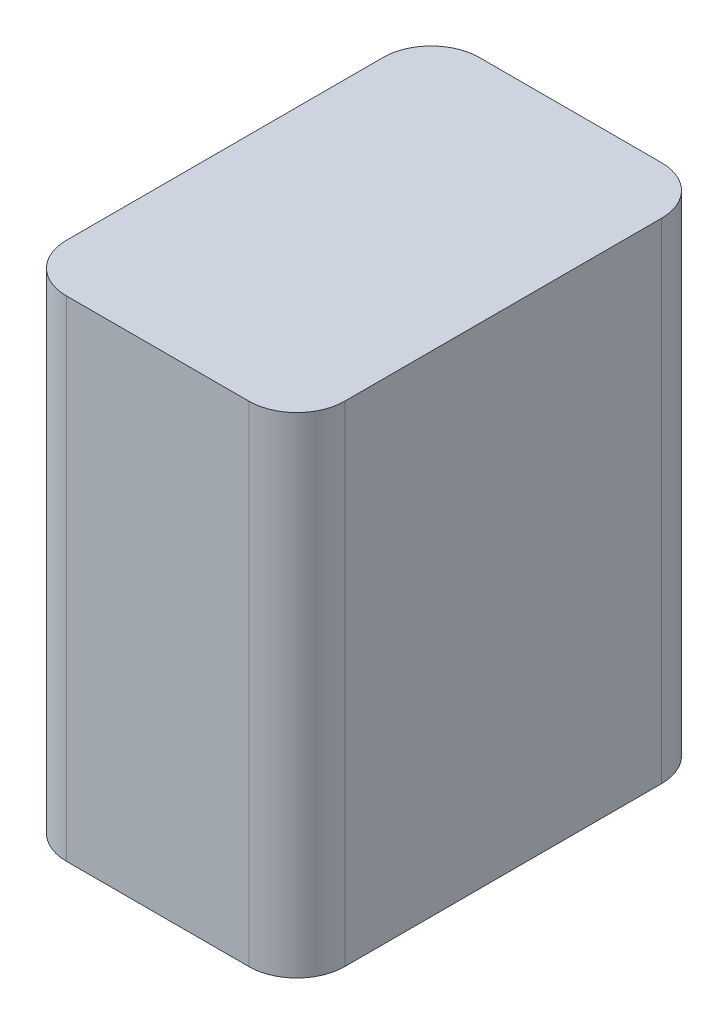
ISO-10303-21;
HEADER;
FILE_DESCRIPTION(('STEP AP214'),'2;1');
FILE_NAME('part.step','',(''),(''),'','','');
FILE_SCHEMA(('AUTOMOTIVE_DESIGN { 1 0 10303 214 1 1 1 1 }'));
ENDSEC;
DATA;
#1=APPLICATION_CONTEXT('core data for automotive mechanical design processes');
#2=APPLICATION_PROTOCOL_DEFINITION('international standard','automotive_design',2000,#1);
#3=PRODUCT_CONTEXT('',#1,'mechanical');
#4=PRODUCT('Part','Part','',(#3));
#5=PRODUCT_RELATED_PRODUCT_CATEGORY('part','',(#4));
#6=PRODUCT_DEFINITION_FORMATION('','',#4);
#7=PRODUCT_DEFINITION_CONTEXT('part definition',#1,'design');
#8=PRODUCT_DEFINITION('design','',#6,#7);
#9=PRODUCT_DEFINITION_SHAPE('','',#8);
#10=(LENGTH_UNIT() NAMED_UNIT(*) SI_UNIT(.MILLI.,.METRE.));
#11=(NAMED_UNIT(*) PLANE_ANGLE_UNIT() SI_UNIT($,.RADIAN.));
#12=(NAMED_UNIT(*) SI_UNIT($,.STERADIAN.) SOLID_ANGLE_UNIT());
#13=UNCERTAINTY_MEASURE_WITH_UNIT(LENGTH_MEASURE(1.E-05),#10,'distance_accuracy_value','');
#14=(GEOMETRIC_REPRESENTATION_CONTEXT(3) GLOBAL_UNCERTAINTY_ASSIGNED_CONTEXT((#13)) GLOBAL_UNIT_ASSIGNED_CONTEXT((#10,
#11,#12)) REPRESENTATION_CONTEXT('',''));
#15=CARTESIAN_POINT('',(0.,0.,0.));
#16=DIRECTION('',(0.,0.,1.));
#17=DIRECTION('',(1.,0.,0.));
#18=AXIS2_PLACEMENT_3D('',#15,#16,#17);
#19=CARTESIAN_POINT('',(0.,51.,0.));
#20=DIRECTION('',(1.,0.,0.));
#21=DIRECTION('',(0.,0.,-1.));
#22=AXIS2_PLACEMENT_3D('',#19,#20,#21);
#23=PLANE('',#22);
#24=DIRECTION('',(0.,0.,1.));
#25=VECTOR('',#24,1.);
#26=CARTESIAN_POINT('',(0.,51.,0.));
#27=LINE('',#26,#25);
#28=CARTESIAN_POINT('',(0.,51.,-38.));
#29=VERTEX_POINT('',#28);
#30=CARTESIAN_POINT('',(0.,51.,-5.));
#31=VERTEX_POINT('',#30);
#32=EDGE_CURVE('E127',#29,#31,#27,.T.);
#33=ORIENTED_EDGE('',*,*,#32,.F.);
#34=DIRECTION('',(0.,-1.,0.));
#35=VECTOR('',#34,1.);
#36=CARTESIAN_POINT('',(0.,51.,-38.));
#37=LINE('',#36,#35);
#38=CARTESIAN_POINT('',(0.,0.,-38.));
#39=VERTEX_POINT('',#38);
#40=EDGE_CURVE('E111',#29,#39,#37,.T.);
#41=ORIENTED_EDGE('',*,*,#40,.T.);
#42=DIRECTION('',(0.,0.,1.));
#43=VECTOR('',#42,1.);
#44=CARTESIAN_POINT('',(0.,0.,0.));
#45=LINE('',#44,#43);
#46=CARTESIAN_POINT('',(0.,0.,-5.));
#47=VERTEX_POINT('',#46);
#48=EDGE_CURVE('E124',#39,#47,#45,.T.);
#49=ORIENTED_EDGE('',*,*,#48,.T.);
#50=DIRECTION('',(0.,-1.,0.));
#51=VECTOR('',#50,1.);
#52=CARTESIAN_POINT('',(0.,51.,-5.));
#53=LINE('',#52,#51);
#54=EDGE_CURVE('E130',#47,#31,#53,.F.);
#55=ORIENTED_EDGE('',*,*,#54,.T.);
#56=EDGE_LOOP('',(#33,#41,#49,#55));
#57=FACE_BOUND('',#56,.T.);
#58=ADVANCED_FACE('F39',(#57),#23,.F.);
#59=CARTESIAN_POINT('',(0.,51.,0.));
#60=DIRECTION('',(0.,0.,-1.));
#61=DIRECTION('',(-1.,0.,0.));
#62=AXIS2_PLACEMENT_3D('',#59,#60,#61);
#63=PLANE('',#62);
#64=DIRECTION('',(1.,0.,0.));
#65=VECTOR('',#64,1.);
#66=CARTESIAN_POINT('',(0.,51.,0.));
#67=LINE('',#66,#65);
#68=CARTESIAN_POINT('',(5.,51.,0.));
#69=VERTEX_POINT('',#68);
#70=CARTESIAN_POINT('',(24.,51.,0.));
#71=VERTEX_POINT('',#70);
#72=EDGE_CURVE('E185',#69,#71,#67,.T.);
#73=ORIENTED_EDGE('',*,*,#72,.F.);
#74=DIRECTION('',(0.,-1.,0.));
#75=VECTOR('',#74,1.);
#76=CARTESIAN_POINT('',(5.,51.,0.));
#77=LINE('',#76,#75);
#78=CARTESIAN_POINT('',(5.,0.,0.));
#79=VERTEX_POINT('',#78);
#80=EDGE_CURVE('E11',#69,#79,#77,.T.);
#81=ORIENTED_EDGE('',*,*,#80,.T.);
#82=DIRECTION('',(1.,0.,0.));
#83=VECTOR('',#82,1.);
#84=CARTESIAN_POINT('',(0.,0.,0.));
#85=LINE('',#84,#83);
#86=CARTESIAN_POINT('',(24.,0.,0.));
#87=VERTEX_POINT('',#86);
#88=EDGE_CURVE('E136',#79,#87,#85,.T.);
#89=ORIENTED_EDGE('',*,*,#88,.T.);
#90=DIRECTION('',(0.,-1.,0.));
#91=VECTOR('',#90,1.);
#92=CARTESIAN_POINT('',(24.,51.,0.));
#93=LINE('',#92,#91);
#94=EDGE_CURVE('E48',#87,#71,#93,.F.);
#95=ORIENTED_EDGE('',*,*,#94,.T.);
#96=EDGE_LOOP('',(#73,#81,#89,#95));
#97=FACE_BOUND('',#96,.T.);
#98=ADVANCED_FACE('F184',(#97),#63,.F.);
#99=CARTESIAN_POINT('',(29.,51.,0.));
#100=DIRECTION('',(-1.,0.,0.));
#101=DIRECTION('',(0.,0.,1.));
#102=AXIS2_PLACEMENT_3D('',#99,#100,#101);
#103=PLANE('',#102);
#104=DIRECTION('',(0.,0.,-1.));
#105=VECTOR('',#104,1.);
#106=CARTESIAN_POINT('',(29.,0.,0.));
#107=LINE('',#106,#105);
#108=CARTESIAN_POINT('',(29.,0.,-5.));
#109=VERTEX_POINT('',#108);
#110=CARTESIAN_POINT('',(29.,0.,-38.));
#111=VERTEX_POINT('',#110);
#112=EDGE_CURVE('E140',#109,#111,#107,.T.);
#113=ORIENTED_EDGE('',*,*,#112,.T.);
#114=DIRECTION('',(0.,-1.,0.));
#115=VECTOR('',#114,1.);
#116=CARTESIAN_POINT('',(29.,51.,-38.));
#117=LINE('',#116,#115);
#118=CARTESIAN_POINT('',(29.,51.,-38.));
#119=VERTEX_POINT('',#118);
#120=EDGE_CURVE('E55',#111,#119,#117,.F.);
#121=ORIENTED_EDGE('',*,*,#120,.T.);
#122=DIRECTION('',(0.,0.,-1.));
#123=VECTOR('',#122,1.);
#124=CARTESIAN_POINT('',(29.,51.,0.));
#125=LINE('',#124,#123);
#126=CARTESIAN_POINT('',(29.,51.,-5.));
#127=VERTEX_POINT('',#126);
#128=EDGE_CURVE('E192',#127,#119,#125,.T.);
#129=ORIENTED_EDGE('',*,*,#128,.F.);
#130=DIRECTION('',(0.,-1.,0.));
#131=VECTOR('',#130,1.);
#132=CARTESIAN_POINT('',(29.,51.,-5.));
#133=LINE('',#132,#131);
#134=EDGE_CURVE('E175',#127,#109,#133,.T.);
#135=ORIENTED_EDGE('',*,*,#134,.T.);
#136=EDGE_LOOP('',(#113,#121,#129,#135));
#137=FACE_BOUND('',#136,.T.);
#138=ADVANCED_FACE('F196',(#137),#103,.F.);
#139=CARTESIAN_POINT('',(0.,51.,-43.));
#140=DIRECTION('',(0.,0.,1.));
#141=DIRECTION('',(1.,0.,0.));
#142=AXIS2_PLACEMENT_3D('',#139,#140,#141);
#143=PLANE('',#142);
#144=DIRECTION('',(-1.,0.,0.));
#145=VECTOR('',#144,1.);
#146=CARTESIAN_POINT('',(0.,0.,-43.));
#147=LINE('',#146,#145);
#148=CARTESIAN_POINT('',(24.,0.,-43.));
#149=VERTEX_POINT('',#148);
#150=CARTESIAN_POINT('',(5.,0.,-43.));
#151=VERTEX_POINT('',#150);
#152=EDGE_CURVE('E148',#149,#151,#147,.T.);
#153=ORIENTED_EDGE('',*,*,#152,.T.);
#154=DIRECTION('',(0.,-1.,0.));
#155=VECTOR('',#154,1.);
#156=CARTESIAN_POINT('',(5.,51.,-43.));
#157=LINE('',#156,#155);
#158=CARTESIAN_POINT('',(5.,51.,-43.));
#159=VERTEX_POINT('',#158);
#160=EDGE_CURVE('E112',#151,#159,#157,.F.);
#161=ORIENTED_EDGE('',*,*,#160,.T.);
#162=DIRECTION('',(-1.,0.,0.));
#163=VECTOR('',#162,1.);
#164=CARTESIAN_POINT('',(0.,51.,-43.));
#165=LINE('',#164,#163);
#166=CARTESIAN_POINT('',(24.,51.,-43.));
#167=VERTEX_POINT('',#166);
#168=EDGE_CURVE('E143',#167,#159,#165,.T.);
#169=ORIENTED_EDGE('',*,*,#168,.F.);
#170=DIRECTION('',(0.,-1.,0.));
#171=VECTOR('',#170,1.);
#172=CARTESIAN_POINT('',(24.,51.,-43.));
#173=LINE('',#172,#171);
#174=EDGE_CURVE('E118',#167,#149,#173,.T.);
#175=ORIENTED_EDGE('',*,*,#174,.T.);
#176=EDGE_LOOP('',(#153,#161,#169,#175));
#177=FACE_BOUND('',#176,.T.);
#178=ADVANCED_FACE('F203',(#177),#143,.F.);
#179=CARTESIAN_POINT('',(0.,51.,0.));
#180=DIRECTION('',(0.,-1.,0.));
#181=DIRECTION('',(0.,0.,-1.));
#182=AXIS2_PLACEMENT_3D('',#179,#180,#181);
#183=PLANE('',#182);
#184=ORIENTED_EDGE('',*,*,#168,.T.);
#185=CARTESIAN_POINT('',(5.,51.,-38.));
#186=DIRECTION('',(0.,-1.,0.));
#187=DIRECTION('',(0.,0.,-1.));
#188=AXIS2_PLACEMENT_3D('',#185,#186,#187);
#189=CIRCLE('',#188,5.);
#190=EDGE_CURVE('E172',#159,#29,#189,.F.);
#191=ORIENTED_EDGE('',*,*,#190,.T.);
#192=ORIENTED_EDGE('',*,*,#32,.T.);
#193=CARTESIAN_POINT('',(5.,51.,-5.));
#194=DIRECTION('',(0.,-1.,0.));
#195=DIRECTION('',(0.,0.,-1.));
#196=AXIS2_PLACEMENT_3D('',#193,#194,#195);
#197=CIRCLE('',#196,5.);
#198=EDGE_CURVE('E166',#31,#69,#197,.F.);
#199=ORIENTED_EDGE('',*,*,#198,.T.);
#200=ORIENTED_EDGE('',*,*,#72,.T.);
#201=CARTESIAN_POINT('',(24.,51.,-5.));
#202=DIRECTION('',(0.,-1.,0.));
#203=DIRECTION('',(0.,0.,-1.));
#204=AXIS2_PLACEMENT_3D('',#201,#202,#203);
#205=CIRCLE('',#204,5.);
#206=EDGE_CURVE('E62',#71,#127,#205,.F.);
#207=ORIENTED_EDGE('',*,*,#206,.T.);
#208=ORIENTED_EDGE('',*,*,#128,.T.);
#209=CARTESIAN_POINT('',(24.,51.,-38.));
#210=DIRECTION('',(0.,-1.,0.));
#211=DIRECTION('',(0.,0.,-1.));
#212=AXIS2_PLACEMENT_3D('',#209,#210,#211);
#213=CIRCLE('',#212,5.);
#214=EDGE_CURVE('E169',#119,#167,#213,.F.);
#215=ORIENTED_EDGE('',*,*,#214,.T.);
#216=EDGE_LOOP('',(#184,#191,#192,#199,#200,#207,#208,#215));
#217=FACE_BOUND('',#216,.T.);
#218=ADVANCED_FACE('F189',(#217),#183,.F.);
#219=CARTESIAN_POINT('',(0.,0.,0.));
#220=DIRECTION('',(0.,-1.,0.));
#221=DIRECTION('',(0.,0.,-1.));
#222=AXIS2_PLACEMENT_3D('',#219,#220,#221);
#223=PLANE('',#222);
#224=ORIENTED_EDGE('',*,*,#48,.F.);
#225=CARTESIAN_POINT('',(5.,0.,-38.));
#226=DIRECTION('',(0.,-1.,0.));
#227=DIRECTION('',(0.,0.,-1.));
#228=AXIS2_PLACEMENT_3D('',#225,#226,#227);
#229=CIRCLE('',#228,5.);
#230=EDGE_CURVE('E107',#39,#151,#229,.T.);
#231=ORIENTED_EDGE('',*,*,#230,.T.);
#232=ORIENTED_EDGE('',*,*,#152,.F.);
#233=CARTESIAN_POINT('',(24.,0.,-38.));
#234=DIRECTION('',(0.,-1.,0.));
#235=DIRECTION('',(0.,0.,-1.));
#236=AXIS2_PLACEMENT_3D('',#233,#234,#235);
#237=CIRCLE('',#236,5.);
#238=EDGE_CURVE('E119',#149,#111,#237,.T.);
#239=ORIENTED_EDGE('',*,*,#238,.T.);
#240=ORIENTED_EDGE('',*,*,#112,.F.);
#241=CARTESIAN_POINT('',(24.,0.,-5.));
#242=DIRECTION('',(0.,-1.,0.));
#243=DIRECTION('',(0.,0.,-1.));
#244=AXIS2_PLACEMENT_3D('',#241,#242,#243);
#245=CIRCLE('',#244,5.);
#246=EDGE_CURVE('E129',#109,#87,#245,.T.);
#247=ORIENTED_EDGE('',*,*,#246,.T.);
#248=ORIENTED_EDGE('',*,*,#88,.F.);
#249=CARTESIAN_POINT('',(5.,0.,-5.));
#250=DIRECTION('',(0.,-1.,0.));
#251=DIRECTION('',(0.,0.,-1.));
#252=AXIS2_PLACEMENT_3D('',#249,#250,#251);
#253=CIRCLE('',#252,5.);
#254=EDGE_CURVE('E134',#79,#47,#253,.T.);
#255=ORIENTED_EDGE('',*,*,#254,.T.);
#256=EDGE_LOOP('',(#224,#231,#232,#239,#240,#247,#248,#255));
#257=FACE_BOUND('',#256,.T.);
#258=ADVANCED_FACE('F132',(#257),#223,.T.);
#259=CARTESIAN_POINT('',(5.,51.,-38.));
#260=DIRECTION('',(0.,-1.,0.));
#261=DIRECTION('',(0.,0.,-1.));
#262=AXIS2_PLACEMENT_3D('',#259,#260,#261);
#263=CYLINDRICAL_SURFACE('',#262,5.);
#264=ORIENTED_EDGE('',*,*,#190,.F.);
#265=ORIENTED_EDGE('',*,*,#160,.F.);
#266=ORIENTED_EDGE('',*,*,#230,.F.);
#267=ORIENTED_EDGE('',*,*,#40,.F.);
#268=EDGE_LOOP('',(#264,#265,#266,#267));
#269=FACE_BOUND('',#268,.T.);
#270=ADVANCED_FACE('F110',(#269),#263,.T.);
#271=CARTESIAN_POINT('',(24.,51.,-38.));
#272=DIRECTION('',(0.,-1.,0.));
#273=DIRECTION('',(0.,0.,-1.));
#274=AXIS2_PLACEMENT_3D('',#271,#272,#273);
#275=CYLINDRICAL_SURFACE('',#274,5.);
#276=ORIENTED_EDGE('',*,*,#214,.F.);
#277=ORIENTED_EDGE('',*,*,#120,.F.);
#278=ORIENTED_EDGE('',*,*,#238,.F.);
#279=ORIENTED_EDGE('',*,*,#174,.F.);
#280=EDGE_LOOP('',(#276,#277,#278,#279));
#281=FACE_BOUND('',#280,.T.);
#282=ADVANCED_FACE('F200',(#281),#275,.T.);
#283=CARTESIAN_POINT('',(5.,51.,-5.));
#284=DIRECTION('',(0.,-1.,0.));
#285=DIRECTION('',(0.,0.,-1.));
#286=AXIS2_PLACEMENT_3D('',#283,#284,#285);
#287=CYLINDRICAL_SURFACE('',#286,5.);
#288=ORIENTED_EDGE('',*,*,#198,.F.);
#289=ORIENTED_EDGE('',*,*,#54,.F.);
#290=ORIENTED_EDGE('',*,*,#254,.F.);
#291=ORIENTED_EDGE('',*,*,#80,.F.);
#292=EDGE_LOOP('',(#288,#289,#290,#291));
#293=FACE_BOUND('',#292,.T.);
#294=ADVANCED_FACE('F209',(#293),#287,.T.);
#295=CARTESIAN_POINT('',(24.,51.,-5.));
#296=DIRECTION('',(0.,-1.,0.));
#297=DIRECTION('',(0.,0.,-1.));
#298=AXIS2_PLACEMENT_3D('',#295,#296,#297);
#299=CYLINDRICAL_SURFACE('',#298,5.);
#300=ORIENTED_EDGE('',*,*,#206,.F.);
#301=ORIENTED_EDGE('',*,*,#94,.F.);
#302=ORIENTED_EDGE('',*,*,#246,.F.);
#303=ORIENTED_EDGE('',*,*,#134,.F.);
#304=EDGE_LOOP('',(#300,#301,#302,#303));
#305=FACE_BOUND('',#304,.T.);
#306=ADVANCED_FACE('F41',(#305),#299,.T.);
#307=CLOSED_SHELL('',(#58,#98,#138,#178,#218,#258,#270,#282,#294,#306));
#308=MANIFOLD_SOLID_BREP('B2',#307);
#309=ADVANCED_BREP_SHAPE_REPRESENTATION('',(#18,#308),#14);
#310=SHAPE_DEFINITION_REPRESENTATION(#9,#309);
ENDSEC;
END-ISO-10303-21;
